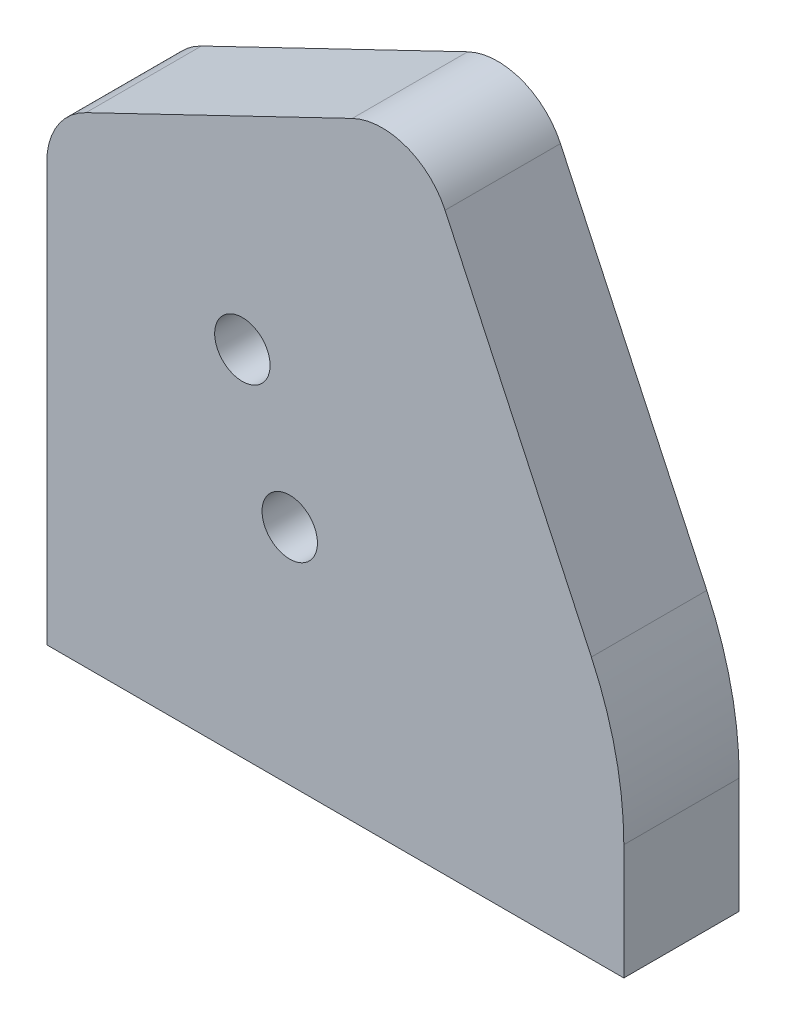
ISO-10303-21;
HEADER;
FILE_DESCRIPTION(('STEP AP214'),'2;1');
FILE_NAME('part.step','',(''),(''),'','','');
FILE_SCHEMA(('AUTOMOTIVE_DESIGN { 1 0 10303 214 1 1 1 1 }'));
ENDSEC;
DATA;
#1=APPLICATION_CONTEXT('core data for automotive mechanical design processes');
#2=APPLICATION_PROTOCOL_DEFINITION('international standard','automotive_design',2000,#1);
#3=PRODUCT_CONTEXT('',#1,'mechanical');
#4=PRODUCT('Part','Part','',(#3));
#5=PRODUCT_RELATED_PRODUCT_CATEGORY('part','',(#4));
#6=PRODUCT_DEFINITION_FORMATION('','',#4);
#7=PRODUCT_DEFINITION_CONTEXT('part definition',#1,'design');
#8=PRODUCT_DEFINITION('design','',#6,#7);
#9=PRODUCT_DEFINITION_SHAPE('','',#8);
#10=(LENGTH_UNIT() NAMED_UNIT(*) SI_UNIT(.MILLI.,.METRE.));
#11=(NAMED_UNIT(*) PLANE_ANGLE_UNIT() SI_UNIT($,.RADIAN.));
#12=(NAMED_UNIT(*) SI_UNIT($,.STERADIAN.) SOLID_ANGLE_UNIT());
#13=UNCERTAINTY_MEASURE_WITH_UNIT(LENGTH_MEASURE(1.E-05),#10,'distance_accuracy_value','');
#14=(GEOMETRIC_REPRESENTATION_CONTEXT(3) GLOBAL_UNCERTAINTY_ASSIGNED_CONTEXT((#13)) GLOBAL_UNIT_ASSIGNED_CONTEXT((#10,
#11,#12)) REPRESENTATION_CONTEXT('',''));
#15=CARTESIAN_POINT('',(0.,0.,0.));
#16=DIRECTION('',(0.,0.,1.));
#17=DIRECTION('',(1.,0.,0.));
#18=AXIS2_PLACEMENT_3D('',#15,#16,#17);
#19=CARTESIAN_POINT('',(12.5,0.,5.));
#20=DIRECTION('',(1.,0.,0.));
#21=DIRECTION('',(0.,1.,0.));
#22=AXIS2_PLACEMENT_3D('',#19,#20,#21);
#23=PLANE('',#22);
#24=DIRECTION('',(0.,-1.,0.));
#25=VECTOR('',#24,1.);
#26=CARTESIAN_POINT('',(12.5,0.,0.));
#27=LINE('',#26,#25);
#28=CARTESIAN_POINT('',(12.5,2.5,0.));
#29=VERTEX_POINT('',#28);
#30=CARTESIAN_POINT('',(12.5,-2.5,0.));
#31=VERTEX_POINT('',#30);
#32=EDGE_CURVE('E112',#29,#31,#27,.T.);
#33=ORIENTED_EDGE('',*,*,#32,.F.);
#34=DIRECTION('',(0.,0.,-1.));
#35=VECTOR('',#34,1.);
#36=CARTESIAN_POINT('',(12.5,2.5,5.));
#37=LINE('',#36,#35);
#38=CARTESIAN_POINT('',(12.5,2.5,5.));
#39=VERTEX_POINT('',#38);
#40=EDGE_CURVE('E108',#39,#29,#37,.T.);
#41=ORIENTED_EDGE('',*,*,#40,.F.);
#42=DIRECTION('',(0.,-1.,0.));
#43=VECTOR('',#42,1.);
#44=CARTESIAN_POINT('',(12.5,0.,5.));
#45=LINE('',#44,#43);
#46=CARTESIAN_POINT('',(12.5,-2.5,5.));
#47=VERTEX_POINT('',#46);
#48=EDGE_CURVE('E110',#39,#47,#45,.T.);
#49=ORIENTED_EDGE('',*,*,#48,.T.);
#50=DIRECTION('',(0.,0.,-1.));
#51=VECTOR('',#50,1.);
#52=CARTESIAN_POINT('',(12.5,-2.5,5.));
#53=LINE('',#52,#51);
#54=EDGE_CURVE('E152',#47,#31,#53,.T.);
#55=ORIENTED_EDGE('',*,*,#54,.T.);
#56=EDGE_LOOP('',(#33,#41,#49,#55));
#57=FACE_BOUND('',#56,.T.);
#58=ADVANCED_FACE('F44',(#57),#23,.T.);
#59=CARTESIAN_POINT('',(-2.5,2.5,5.));
#60=DIRECTION('',(0.,0.,-1.));
#61=DIRECTION('',(-1.,0.,0.));
#62=AXIS2_PLACEMENT_3D('',#59,#60,#61);
#63=CYLINDRICAL_SURFACE('',#62,15.);
#64=CARTESIAN_POINT('',(-2.5,2.5,0.));
#65=DIRECTION('',(0.,0.,1.));
#66=DIRECTION('',(1.,0.,0.));
#67=AXIS2_PLACEMENT_3D('',#64,#65,#66);
#68=CIRCLE('',#67,15.);
#69=CARTESIAN_POINT('',(11.0946168055497,8.83927392611056,0.));
#70=VERTEX_POINT('',#69);
#71=EDGE_CURVE('E155',#70,#29,#68,.F.);
#72=ORIENTED_EDGE('',*,*,#71,.F.);
#73=DIRECTION('',(0.,0.,-1.));
#74=VECTOR('',#73,1.);
#75=CARTESIAN_POINT('',(11.0946168055497,8.83927392611056,5.));
#76=LINE('',#75,#74);
#77=CARTESIAN_POINT('',(11.0946168055497,8.83927392611056,5.));
#78=VERTEX_POINT('',#77);
#79=EDGE_CURVE('E119',#78,#70,#76,.T.);
#80=ORIENTED_EDGE('',*,*,#79,.F.);
#81=CARTESIAN_POINT('',(-2.5,2.5,5.));
#82=DIRECTION('',(0.,0.,1.));
#83=DIRECTION('',(1.,0.,0.));
#84=AXIS2_PLACEMENT_3D('',#81,#82,#83);
#85=CIRCLE('',#84,15.);
#86=EDGE_CURVE('E124',#78,#39,#85,.F.);
#87=ORIENTED_EDGE('',*,*,#86,.T.);
#88=ORIENTED_EDGE('',*,*,#40,.T.);
#89=EDGE_LOOP('',(#72,#80,#87,#88));
#90=FACE_BOUND('',#89,.T.);
#91=ADVANCED_FACE('F131',(#90),#63,.T.);
#92=CARTESIAN_POINT('',(12.4986878473403,5.82823386010366,5.));
#93=DIRECTION('',(-0.906307787036648,-0.422618261740704,0.));
#94=DIRECTION('',(0.422618261740704,-0.906307787036648,0.));
#95=AXIS2_PLACEMENT_3D('',#92,#93,#94);
#96=PLANE('',#95);
#97=DIRECTION('',(-0.422618261740704,0.906307787036648,0.));
#98=VECTOR('',#97,1.);
#99=CARTESIAN_POINT('',(12.4986878473403,5.82823386010366,0.));
#100=LINE('',#99,#98);
#101=CARTESIAN_POINT('',(4.75534287943916,22.4338907316603,0.));
#102=VERTEX_POINT('',#101);
#103=EDGE_CURVE('E159',#70,#102,#100,.T.);
#104=ORIENTED_EDGE('',*,*,#103,.T.);
#105=DIRECTION('',(0.,0.,-1.));
#106=VECTOR('',#105,1.);
#107=CARTESIAN_POINT('',(4.75534287943916,22.4338907316603,5.));
#108=LINE('',#107,#106);
#109=CARTESIAN_POINT('',(4.75534287943916,22.4338907316603,5.));
#110=VERTEX_POINT('',#109);
#111=EDGE_CURVE('E185',#110,#102,#108,.T.);
#112=ORIENTED_EDGE('',*,*,#111,.F.);
#113=DIRECTION('',(-0.422618261740704,0.906307787036648,0.));
#114=VECTOR('',#113,1.);
#115=CARTESIAN_POINT('',(12.4986878473403,5.82823386010366,5.));
#116=LINE('',#115,#114);
#117=EDGE_CURVE('E134',#78,#110,#116,.T.);
#118=ORIENTED_EDGE('',*,*,#117,.F.);
#119=ORIENTED_EDGE('',*,*,#79,.T.);
#120=EDGE_LOOP('',(#104,#112,#118,#119));
#121=FACE_BOUND('',#120,.T.);
#122=ADVANCED_FACE('F222',(#121),#96,.F.);
#123=CARTESIAN_POINT('',(2.03641951832921,21.1660359464382,5.));
#124=DIRECTION('',(0.,0.,-1.));
#125=DIRECTION('',(-1.,0.,0.));
#126=AXIS2_PLACEMENT_3D('',#123,#124,#125);
#127=CYLINDRICAL_SURFACE('',#126,3.);
#128=CARTESIAN_POINT('',(2.03641951832921,21.1660359464382,0.));
#129=DIRECTION('',(0.,0.,1.));
#130=DIRECTION('',(1.,0.,0.));
#131=AXIS2_PLACEMENT_3D('',#128,#129,#130);
#132=CIRCLE('',#131,3.);
#133=CARTESIAN_POINT('',(0.735528696021778,23.869308605353,0.));
#134=VERTEX_POINT('',#133);
#135=EDGE_CURVE('E162',#102,#134,#132,.T.);
#136=ORIENTED_EDGE('',*,*,#135,.T.);
#137=DIRECTION('',(0.,0.,-1.));
#138=VECTOR('',#137,1.);
#139=CARTESIAN_POINT('',(0.735528696021778,23.869308605353,5.));
#140=LINE('',#139,#138);
#141=CARTESIAN_POINT('',(0.735528696021778,23.869308605353,5.));
#142=VERTEX_POINT('',#141);
#143=EDGE_CURVE('E181',#142,#134,#140,.T.);
#144=ORIENTED_EDGE('',*,*,#143,.F.);
#145=CARTESIAN_POINT('',(2.03641951832921,21.1660359464382,5.));
#146=DIRECTION('',(0.,0.,1.));
#147=DIRECTION('',(1.,0.,0.));
#148=AXIS2_PLACEMENT_3D('',#145,#146,#147);
#149=CIRCLE('',#148,3.);
#150=EDGE_CURVE('E137',#110,#142,#149,.T.);
#151=ORIENTED_EDGE('',*,*,#150,.F.);
#152=ORIENTED_EDGE('',*,*,#111,.T.);
#153=EDGE_LOOP('',(#136,#144,#151,#152));
#154=FACE_BOUND('',#153,.T.);
#155=ADVANCED_FACE('F227',(#154),#127,.T.);
#156=CARTESIAN_POINT('',(-9.1883952230713,19.0936373444273,5.));
#157=DIRECTION('',(-0.433630274102478,0.901090886304933,0.));
#158=DIRECTION('',(-0.901090886304933,-0.433630274102478,0.));
#159=AXIS2_PLACEMENT_3D('',#156,#157,#158);
#160=PLANE('',#159);
#161=DIRECTION('',(0.901090886304933,0.433630274102478,0.));
#162=VECTOR('',#161,1.);
#163=CARTESIAN_POINT('',(-9.1883952230713,19.0936373444273,0.));
#164=LINE('',#163,#162);
#165=CARTESIAN_POINT('',(-10.8008908223074,18.3176591170222,0.));
#166=VERTEX_POINT('',#165);
#167=EDGE_CURVE('E166',#166,#134,#164,.T.);
#168=ORIENTED_EDGE('',*,*,#167,.F.);
#169=DIRECTION('',(0.,0.,-1.));
#170=VECTOR('',#169,1.);
#171=CARTESIAN_POINT('',(-10.8008908223074,18.3176591170222,5.));
#172=LINE('',#171,#170);
#173=CARTESIAN_POINT('',(-10.8008908223074,18.3176591170222,5.));
#174=VERTEX_POINT('',#173);
#175=EDGE_CURVE('E53',#166,#174,#172,.F.);
#176=ORIENTED_EDGE('',*,*,#175,.T.);
#177=DIRECTION('',(0.901090886304933,0.433630274102478,0.));
#178=VECTOR('',#177,1.);
#179=CARTESIAN_POINT('',(-9.1883952230713,19.0936373444273,5.));
#180=LINE('',#179,#178);
#181=EDGE_CURVE('E144',#174,#142,#180,.T.);
#182=ORIENTED_EDGE('',*,*,#181,.T.);
#183=ORIENTED_EDGE('',*,*,#143,.T.);
#184=EDGE_LOOP('',(#168,#176,#182,#183));
#185=FACE_BOUND('',#184,.T.);
#186=ADVANCED_FACE('F215',(#185),#160,.T.);
#187=CARTESIAN_POINT('',(-12.5,0.,5.));
#188=DIRECTION('',(1.,0.,0.));
#189=DIRECTION('',(0.,0.,-1.));
#190=AXIS2_PLACEMENT_3D('',#187,#188,#189);
#191=PLANE('',#190);
#192=DIRECTION('',(0.,-1.,0.));
#193=VECTOR('',#192,1.);
#194=CARTESIAN_POINT('',(-12.5,0.,5.));
#195=LINE('',#194,#193);
#196=CARTESIAN_POINT('',(-12.5,15.6143864581074,5.));
#197=VERTEX_POINT('',#196);
#198=CARTESIAN_POINT('',(-12.5,-2.5,5.));
#199=VERTEX_POINT('',#198);
#200=EDGE_CURVE('E147',#197,#199,#195,.T.);
#201=ORIENTED_EDGE('',*,*,#200,.F.);
#202=DIRECTION('',(0.,0.,-1.));
#203=VECTOR('',#202,1.);
#204=CARTESIAN_POINT('',(-12.5,15.6143864581074,0.));
#205=LINE('',#204,#203);
#206=CARTESIAN_POINT('',(-12.5,15.6143864581074,0.));
#207=VERTEX_POINT('',#206);
#208=EDGE_CURVE('E118',#197,#207,#205,.T.);
#209=ORIENTED_EDGE('',*,*,#208,.T.);
#210=DIRECTION('',(0.,-1.,0.));
#211=VECTOR('',#210,1.);
#212=CARTESIAN_POINT('',(-12.5,0.,0.));
#213=LINE('',#212,#211);
#214=CARTESIAN_POINT('',(-12.5,-2.5,0.));
#215=VERTEX_POINT('',#214);
#216=EDGE_CURVE('E169',#207,#215,#213,.T.);
#217=ORIENTED_EDGE('',*,*,#216,.T.);
#218=DIRECTION('',(0.,0.,-1.));
#219=VECTOR('',#218,1.);
#220=CARTESIAN_POINT('',(-12.5,-2.5,5.));
#221=LINE('',#220,#219);
#222=EDGE_CURVE('E177',#199,#215,#221,.T.);
#223=ORIENTED_EDGE('',*,*,#222,.F.);
#224=EDGE_LOOP('',(#201,#209,#217,#223));
#225=FACE_BOUND('',#224,.T.);
#226=ADVANCED_FACE('F199',(#225),#191,.F.);
#227=CARTESIAN_POINT('',(0.,-2.5,5.));
#228=DIRECTION('',(0.,1.,0.));
#229=DIRECTION('',(0.,0.,1.));
#230=AXIS2_PLACEMENT_3D('',#227,#228,#229);
#231=PLANE('',#230);
#232=DIRECTION('',(1.,0.,0.));
#233=VECTOR('',#232,1.);
#234=CARTESIAN_POINT('',(0.,-2.5,0.));
#235=LINE('',#234,#233);
#236=EDGE_CURVE('E129',#215,#31,#235,.T.);
#237=ORIENTED_EDGE('',*,*,#236,.T.);
#238=ORIENTED_EDGE('',*,*,#54,.F.);
#239=DIRECTION('',(1.,0.,0.));
#240=VECTOR('',#239,1.);
#241=CARTESIAN_POINT('',(0.,-2.5,5.));
#242=LINE('',#241,#240);
#243=EDGE_CURVE('E126',#199,#47,#242,.T.);
#244=ORIENTED_EDGE('',*,*,#243,.F.);
#245=ORIENTED_EDGE('',*,*,#222,.T.);
#246=EDGE_LOOP('',(#237,#238,#244,#245));
#247=FACE_BOUND('',#246,.T.);
#248=ADVANCED_FACE('F206',(#247),#231,.F.);
#249=CARTESIAN_POINT('',(0.,0.,5.));
#250=DIRECTION('',(0.,0.,1.));
#251=DIRECTION('',(1.,0.,0.));
#252=AXIS2_PLACEMENT_3D('',#249,#250,#251);
#253=PLANE('',#252);
#254=CARTESIAN_POINT('',(-4.02606042997701,12.8190778623577,5.));
#255=DIRECTION('',(0.,0.,1.));
#256=DIRECTION('',(1.,0.,0.));
#257=AXIS2_PLACEMENT_3D('',#254,#255,#256);
#258=CIRCLE('',#257,1.19999999999999);
#259=CARTESIAN_POINT('',(-2.82606042997702,12.8190778623577,5.));
#260=VERTEX_POINT('',#259);
#261=EDGE_CURVE('E272',#260,#260,#258,.T.);
#262=ORIENTED_EDGE('',*,*,#261,.F.);
#263=EDGE_LOOP('',(#262));
#264=FACE_BOUND('',#263,.T.);
#265=CARTESIAN_POINT('',(-1.97393957002299,7.18092213764228,5.));
#266=DIRECTION('',(0.,0.,1.));
#267=DIRECTION('',(1.,0.,0.));
#268=AXIS2_PLACEMENT_3D('',#265,#266,#267);
#269=CIRCLE('',#268,1.19999999999999);
#270=CARTESIAN_POINT('',(-0.773939570023005,7.18092213764228,5.));
#271=VERTEX_POINT('',#270);
#272=EDGE_CURVE('E265',#271,#271,#269,.T.);
#273=ORIENTED_EDGE('',*,*,#272,.F.);
#274=EDGE_LOOP('',(#273));
#275=FACE_BOUND('',#274,.T.);
#276=ORIENTED_EDGE('',*,*,#181,.F.);
#277=CARTESIAN_POINT('',(-9.5,15.6143864581074,5.));
#278=DIRECTION('',(0.,0.,1.));
#279=DIRECTION('',(1.,0.,0.));
#280=AXIS2_PLACEMENT_3D('',#277,#278,#279);
#281=CIRCLE('',#280,3.);
#282=EDGE_CURVE('E11',#174,#197,#281,.T.);
#283=ORIENTED_EDGE('',*,*,#282,.T.);
#284=ORIENTED_EDGE('',*,*,#200,.T.);
#285=ORIENTED_EDGE('',*,*,#243,.T.);
#286=ORIENTED_EDGE('',*,*,#48,.F.);
#287=ORIENTED_EDGE('',*,*,#86,.F.);
#288=ORIENTED_EDGE('',*,*,#117,.T.);
#289=ORIENTED_EDGE('',*,*,#150,.T.);
#290=EDGE_LOOP('',(#276,#283,#284,#285,#286,#287,#288,#289));
#291=FACE_BOUND('',#290,.T.);
#292=ADVANCED_FACE('F123',(#264,#275,#291),#253,.T.);
#293=CARTESIAN_POINT('',(0.,0.,0.));
#294=DIRECTION('',(0.,0.,1.));
#295=DIRECTION('',(1.,0.,0.));
#296=AXIS2_PLACEMENT_3D('',#293,#294,#295);
#297=PLANE('',#296);
#298=CARTESIAN_POINT('',(-4.02606042997701,12.8190778623577,0.));
#299=DIRECTION('',(0.,0.,1.));
#300=DIRECTION('',(1.,0.,0.));
#301=AXIS2_PLACEMENT_3D('',#298,#299,#300);
#302=CIRCLE('',#301,1.2);
#303=CARTESIAN_POINT('',(-2.82606042997701,12.8190778623577,0.));
#304=VERTEX_POINT('',#303);
#305=EDGE_CURVE('E261',#304,#304,#302,.T.);
#306=ORIENTED_EDGE('',*,*,#305,.T.);
#307=EDGE_LOOP('',(#306));
#308=FACE_BOUND('',#307,.T.);
#309=CARTESIAN_POINT('',(-1.97393957002299,7.18092213764228,0.));
#310=DIRECTION('',(0.,0.,1.));
#311=DIRECTION('',(1.,0.,0.));
#312=AXIS2_PLACEMENT_3D('',#309,#310,#311);
#313=CIRCLE('',#312,1.2);
#314=CARTESIAN_POINT('',(-0.773939570022993,7.18092213764228,0.));
#315=VERTEX_POINT('',#314);
#316=EDGE_CURVE('E156',#315,#315,#313,.T.);
#317=ORIENTED_EDGE('',*,*,#316,.T.);
#318=EDGE_LOOP('',(#317));
#319=FACE_BOUND('',#318,.T.);
#320=ORIENTED_EDGE('',*,*,#216,.F.);
#321=CARTESIAN_POINT('',(-9.5,15.6143864581074,0.));
#322=DIRECTION('',(0.,0.,1.));
#323=DIRECTION('',(1.,0.,0.));
#324=AXIS2_PLACEMENT_3D('',#321,#322,#323);
#325=CIRCLE('',#324,3.);
#326=EDGE_CURVE('E67',#207,#166,#325,.F.);
#327=ORIENTED_EDGE('',*,*,#326,.T.);
#328=ORIENTED_EDGE('',*,*,#167,.T.);
#329=ORIENTED_EDGE('',*,*,#135,.F.);
#330=ORIENTED_EDGE('',*,*,#103,.F.);
#331=ORIENTED_EDGE('',*,*,#71,.T.);
#332=ORIENTED_EDGE('',*,*,#32,.T.);
#333=ORIENTED_EDGE('',*,*,#236,.F.);
#334=EDGE_LOOP('',(#320,#327,#328,#329,#330,#331,#332,#333));
#335=FACE_BOUND('',#334,.T.);
#336=ADVANCED_FACE('F204',(#308,#319,#335),#297,.F.);
#337=CARTESIAN_POINT('',(-1.97393957002299,7.18092213764228,5.));
#338=DIRECTION('',(0.,0.,1.));
#339=DIRECTION('',(1.,0.,0.));
#340=AXIS2_PLACEMENT_3D('',#337,#338,#339);
#341=CYLINDRICAL_SURFACE('',#340,1.19999999999999);
#342=ORIENTED_EDGE('',*,*,#316,.F.);
#343=EDGE_LOOP('',(#342));
#344=FACE_BOUND('',#343,.T.);
#345=ORIENTED_EDGE('',*,*,#272,.T.);
#346=EDGE_LOOP('',(#345));
#347=FACE_BOUND('',#346,.T.);
#348=ADVANCED_FACE('F245',(#344,#347),#341,.F.);
#349=CARTESIAN_POINT('',(-4.02606042997701,12.8190778623577,5.));
#350=DIRECTION('',(0.,0.,1.));
#351=DIRECTION('',(1.,0.,0.));
#352=AXIS2_PLACEMENT_3D('',#349,#350,#351);
#353=CYLINDRICAL_SURFACE('',#352,1.19999999999999);
#354=ORIENTED_EDGE('',*,*,#305,.F.);
#355=EDGE_LOOP('',(#354));
#356=FACE_BOUND('',#355,.T.);
#357=ORIENTED_EDGE('',*,*,#261,.T.);
#358=EDGE_LOOP('',(#357));
#359=FACE_BOUND('',#358,.T.);
#360=ADVANCED_FACE('F241',(#356,#359),#353,.F.);
#361=CARTESIAN_POINT('',(-9.5,15.6143864581074,5.));
#362=DIRECTION('',(0.,0.,1.));
#363=DIRECTION('',(1.,0.,0.));
#364=AXIS2_PLACEMENT_3D('',#361,#362,#363);
#365=CYLINDRICAL_SURFACE('',#364,3.);
#366=ORIENTED_EDGE('',*,*,#282,.F.);
#367=ORIENTED_EDGE('',*,*,#175,.F.);
#368=ORIENTED_EDGE('',*,*,#326,.F.);
#369=ORIENTED_EDGE('',*,*,#208,.F.);
#370=EDGE_LOOP('',(#366,#367,#368,#369));
#371=FACE_BOUND('',#370,.T.);
#372=ADVANCED_FACE('F46',(#371),#365,.T.);
#373=CLOSED_SHELL('',(#58,#91,#122,#155,#186,#226,#248,#292,#336,#348,#360,#372));
#374=MANIFOLD_SOLID_BREP('B2',#373);
#375=ADVANCED_BREP_SHAPE_REPRESENTATION('',(#18,#374),#14);
#376=SHAPE_DEFINITION_REPRESENTATION(#9,#375);
ENDSEC;
END-ISO-10303-21;
